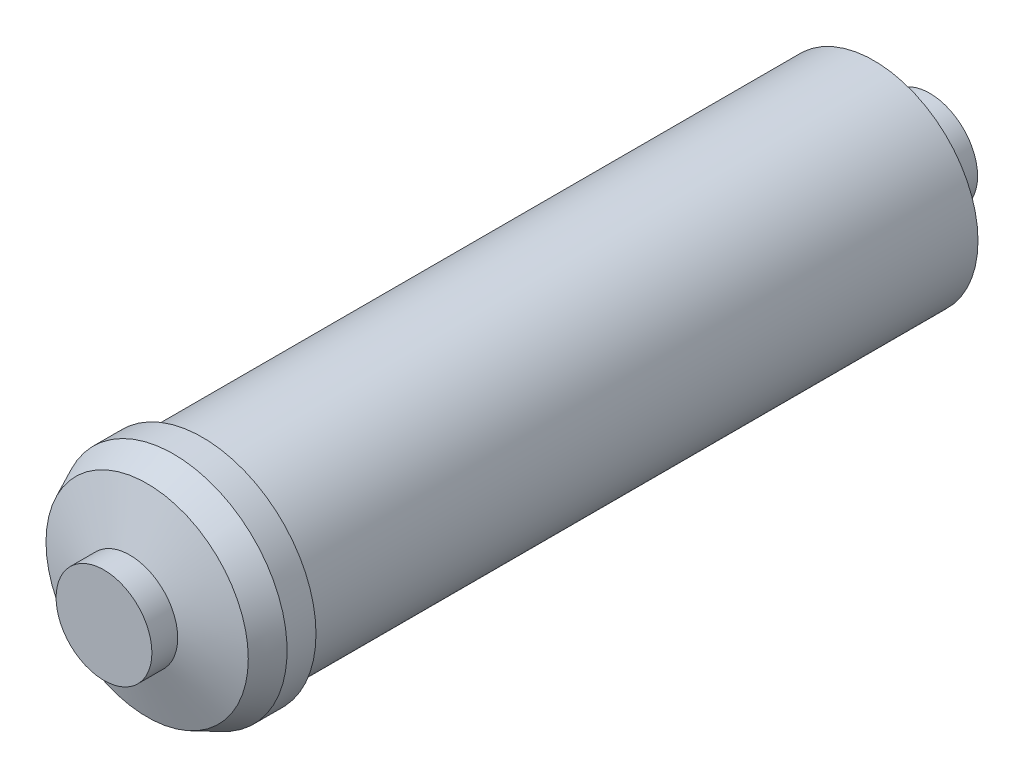
ISO-10303-21;
HEADER;
FILE_DESCRIPTION(('STEP AP214'),'2;1');
FILE_NAME('part.step','',(''),(''),'','','');
FILE_SCHEMA(('AUTOMOTIVE_DESIGN { 1 0 10303 214 1 1 1 1 }'));
ENDSEC;
DATA;
#1=APPLICATION_CONTEXT('core data for automotive mechanical design processes');
#2=APPLICATION_PROTOCOL_DEFINITION('international standard','automotive_design',2000,#1);
#3=PRODUCT_CONTEXT('',#1,'mechanical');
#4=PRODUCT('Part','Part','',(#3));
#5=PRODUCT_RELATED_PRODUCT_CATEGORY('part','',(#4));
#6=PRODUCT_DEFINITION_FORMATION('','',#4);
#7=PRODUCT_DEFINITION_CONTEXT('part definition',#1,'design');
#8=PRODUCT_DEFINITION('design','',#6,#7);
#9=PRODUCT_DEFINITION_SHAPE('','',#8);
#10=(LENGTH_UNIT() NAMED_UNIT(*) SI_UNIT(.MILLI.,.METRE.));
#11=(NAMED_UNIT(*) PLANE_ANGLE_UNIT() SI_UNIT($,.RADIAN.));
#12=(NAMED_UNIT(*) SI_UNIT($,.STERADIAN.) SOLID_ANGLE_UNIT());
#13=UNCERTAINTY_MEASURE_WITH_UNIT(LENGTH_MEASURE(1.E-05),#10,'distance_accuracy_value','');
#14=(GEOMETRIC_REPRESENTATION_CONTEXT(3) GLOBAL_UNCERTAINTY_ASSIGNED_CONTEXT((#13)) GLOBAL_UNIT_ASSIGNED_CONTEXT((#10,
#11,#12)) REPRESENTATION_CONTEXT('',''));
#15=CARTESIAN_POINT('',(0.,0.,0.));
#16=DIRECTION('',(0.,0.,1.));
#17=DIRECTION('',(1.,0.,0.));
#18=AXIS2_PLACEMENT_3D('',#15,#16,#17);
#19=CARTESIAN_POINT('',(0.,0.,8.255));
#20=DIRECTION('',(0.,0.,-1.));
#21=DIRECTION('',(-1.,0.,0.));
#22=AXIS2_PLACEMENT_3D('',#19,#20,#21);
#23=CYLINDRICAL_SURFACE('',#22,14.732);
#24=CARTESIAN_POINT('',(0.,0.,8.255));
#25=DIRECTION('',(0.,0.,1.));
#26=DIRECTION('',(1.,0.,0.));
#27=AXIS2_PLACEMENT_3D('',#24,#25,#26);
#28=CIRCLE('',#27,14.732);
#29=CARTESIAN_POINT('',(14.732,0.,8.255));
#30=VERTEX_POINT('',#29);
#31=EDGE_CURVE('E11',#30,#30,#28,.T.);
#32=ORIENTED_EDGE('',*,*,#31,.F.);
#33=EDGE_LOOP('',(#32));
#34=FACE_BOUND('',#33,.T.);
#35=CARTESIAN_POINT('',(0.,0.,0.));
#36=DIRECTION('',(0.,0.,1.));
#37=DIRECTION('',(1.,0.,0.));
#38=AXIS2_PLACEMENT_3D('',#35,#36,#37);
#39=CIRCLE('',#38,14.732);
#40=CARTESIAN_POINT('',(14.732,0.,0.));
#41=VERTEX_POINT('',#40);
#42=EDGE_CURVE('E53',#41,#41,#39,.T.);
#43=ORIENTED_EDGE('',*,*,#42,.T.);
#44=EDGE_LOOP('',(#43));
#45=FACE_BOUND('',#44,.T.);
#46=ADVANCED_FACE('F50',(#34,#45),#23,.T.);
#47=CARTESIAN_POINT('',(0.,0.,0.));
#48=DIRECTION('',(0.,0.,1.));
#49=DIRECTION('',(1.,0.,0.));
#50=AXIS2_PLACEMENT_3D('',#47,#48,#49);
#51=PLANE('',#50);
#52=ORIENTED_EDGE('',*,*,#42,.F.);
#53=EDGE_LOOP('',(#52));
#54=FACE_BOUND('',#53,.T.);
#55=ADVANCED_FACE('F87',(#54),#51,.F.);
#56=CARTESIAN_POINT('',(0.,0.,8.255));
#57=DIRECTION('',(0.,0.,1.));
#58=DIRECTION('',(1.,0.,0.));
#59=AXIS2_PLACEMENT_3D('',#56,#57,#58);
#60=CONICAL_SURFACE('',#59,14.732,1.0954533446284);
#61=ORIENTED_EDGE('',*,*,#31,.T.);
#62=EDGE_LOOP('',(#61));
#63=FACE_BOUND('',#62,.T.);
#64=CARTESIAN_POINT('',(0.,0.,17.145));
#65=DIRECTION('',(0.,0.,1.));
#66=DIRECTION('',(1.,0.,0.));
#67=AXIS2_PLACEMENT_3D('',#64,#65,#66);
#68=CIRCLE('',#67,32.004);
#69=CARTESIAN_POINT('',(32.004,0.,17.145));
#70=VERTEX_POINT('',#69);
#71=EDGE_CURVE('E56',#70,#70,#68,.T.);
#72=ORIENTED_EDGE('',*,*,#71,.F.);
#73=EDGE_LOOP('',(#72));
#74=FACE_BOUND('',#73,.T.);
#75=ADVANCED_FACE('F83',(#63,#74),#60,.T.);
#76=CARTESIAN_POINT('',(0.,0.,223.7232));
#77=DIRECTION('',(0.,0.,-1.));
#78=DIRECTION('',(-1.,0.,0.));
#79=AXIS2_PLACEMENT_3D('',#76,#77,#78);
#80=CYLINDRICAL_SURFACE('',#79,32.004);
#81=CARTESIAN_POINT('',(0.,0.,223.7232));
#82=DIRECTION('',(0.,0.,1.));
#83=DIRECTION('',(1.,0.,0.));
#84=AXIS2_PLACEMENT_3D('',#81,#82,#83);
#85=CIRCLE('',#84,32.004);
#86=CARTESIAN_POINT('',(32.004,0.,223.7232));
#87=VERTEX_POINT('',#86);
#88=EDGE_CURVE('E105',#87,#87,#85,.T.);
#89=ORIENTED_EDGE('',*,*,#88,.F.);
#90=EDGE_LOOP('',(#89));
#91=FACE_BOUND('',#90,.T.);
#92=ORIENTED_EDGE('',*,*,#71,.T.);
#93=EDGE_LOOP('',(#92));
#94=FACE_BOUND('',#93,.T.);
#95=ADVANCED_FACE('F73',(#91,#94),#80,.T.);
#96=CARTESIAN_POINT('',(0.,0.,232.6132));
#97=DIRECTION('',(0.,0.,-1.));
#98=DIRECTION('',(-1.,0.,0.));
#99=AXIS2_PLACEMENT_3D('',#96,#97,#98);
#100=CYLINDRICAL_SURFACE('',#99,34.925);
#101=CARTESIAN_POINT('',(0.,0.,232.6132));
#102=DIRECTION('',(0.,0.,-1.));
#103=DIRECTION('',(-1.,0.,0.));
#104=AXIS2_PLACEMENT_3D('',#101,#102,#103);
#105=CIRCLE('',#104,34.925);
#106=CARTESIAN_POINT('',(-34.925,0.,232.6132));
#107=VERTEX_POINT('',#106);
#108=EDGE_CURVE('E102',#107,#107,#105,.F.);
#109=ORIENTED_EDGE('',*,*,#108,.F.);
#110=EDGE_LOOP('',(#109));
#111=FACE_BOUND('',#110,.T.);
#112=CARTESIAN_POINT('',(0.,0.,223.7232));
#113=DIRECTION('',(0.,0.,1.));
#114=DIRECTION('',(1.,0.,0.));
#115=AXIS2_PLACEMENT_3D('',#112,#113,#114);
#116=CIRCLE('',#115,34.925);
#117=CARTESIAN_POINT('',(34.925,0.,223.7232));
#118=VERTEX_POINT('',#117);
#119=EDGE_CURVE('E106',#118,#118,#116,.T.);
#120=ORIENTED_EDGE('',*,*,#119,.T.);
#121=EDGE_LOOP('',(#120));
#122=FACE_BOUND('',#121,.T.);
#123=ADVANCED_FACE('F85',(#111,#122),#100,.T.);
#124=CARTESIAN_POINT('',(0.,0.,223.7232));
#125=DIRECTION('',(0.,0.,1.));
#126=DIRECTION('',(1.,0.,0.));
#127=AXIS2_PLACEMENT_3D('',#124,#125,#126);
#128=PLANE('',#127);
#129=ORIENTED_EDGE('',*,*,#88,.T.);
#130=EDGE_LOOP('',(#129));
#131=FACE_BOUND('',#130,.T.);
#132=ORIENTED_EDGE('',*,*,#119,.F.);
#133=EDGE_LOOP('',(#132));
#134=FACE_BOUND('',#133,.T.);
#135=ADVANCED_FACE('F134',(#131,#134),#128,.F.);
#136=CARTESIAN_POINT('',(0.,0.,240.7412));
#137=DIRECTION('',(0.,0.,-1.));
#138=DIRECTION('',(-1.,0.,0.));
#139=AXIS2_PLACEMENT_3D('',#136,#137,#138);
#140=CONICAL_SURFACE('',#139,31.115,0.438336559857958);
#141=ORIENTED_EDGE('',*,*,#108,.T.);
#142=EDGE_LOOP('',(#141));
#143=FACE_BOUND('',#142,.T.);
#144=CARTESIAN_POINT('',(0.,0.,240.7412));
#145=DIRECTION('',(0.,0.,1.));
#146=DIRECTION('',(1.,0.,0.));
#147=AXIS2_PLACEMENT_3D('',#144,#145,#146);
#148=CIRCLE('',#147,31.115);
#149=CARTESIAN_POINT('',(31.115,0.,240.7412));
#150=VERTEX_POINT('',#149);
#151=EDGE_CURVE('E107',#150,#150,#148,.T.);
#152=ORIENTED_EDGE('',*,*,#151,.F.);
#153=EDGE_LOOP('',(#152));
#154=FACE_BOUND('',#153,.T.);
#155=ADVANCED_FACE('F128',(#143,#154),#140,.T.);
#156=CARTESIAN_POINT('',(0.,0.,246.0752));
#157=DIRECTION('',(0.,0.,-1.));
#158=DIRECTION('',(-1.,0.,0.));
#159=AXIS2_PLACEMENT_3D('',#156,#157,#158);
#160=CONICAL_SURFACE('',#159,14.732,1.25603866540359);
#161=ORIENTED_EDGE('',*,*,#151,.T.);
#162=EDGE_LOOP('',(#161));
#163=FACE_BOUND('',#162,.T.);
#164=CARTESIAN_POINT('',(0.,0.,246.0752));
#165=DIRECTION('',(0.,0.,1.));
#166=DIRECTION('',(1.,0.,0.));
#167=AXIS2_PLACEMENT_3D('',#164,#165,#166);
#168=CIRCLE('',#167,14.732);
#169=CARTESIAN_POINT('',(14.732,0.,246.0752));
#170=VERTEX_POINT('',#169);
#171=EDGE_CURVE('E115',#170,#170,#168,.T.);
#172=ORIENTED_EDGE('',*,*,#171,.F.);
#173=EDGE_LOOP('',(#172));
#174=FACE_BOUND('',#173,.T.);
#175=ADVANCED_FACE('F121',(#163,#174),#160,.T.);
#176=CARTESIAN_POINT('',(0.,0.,254.0127));
#177=DIRECTION('',(0.,0.,-1.));
#178=DIRECTION('',(-1.,0.,0.));
#179=AXIS2_PLACEMENT_3D('',#176,#177,#178);
#180=CYLINDRICAL_SURFACE('',#179,14.732);
#181=CARTESIAN_POINT('',(0.,0.,254.0127));
#182=DIRECTION('',(0.,0.,1.));
#183=DIRECTION('',(1.,0.,0.));
#184=AXIS2_PLACEMENT_3D('',#181,#182,#183);
#185=CIRCLE('',#184,14.732);
#186=CARTESIAN_POINT('',(14.732,0.,254.0127));
#187=VERTEX_POINT('',#186);
#188=EDGE_CURVE('E114',#187,#187,#185,.T.);
#189=ORIENTED_EDGE('',*,*,#188,.F.);
#190=EDGE_LOOP('',(#189));
#191=FACE_BOUND('',#190,.T.);
#192=ORIENTED_EDGE('',*,*,#171,.T.);
#193=EDGE_LOOP('',(#192));
#194=FACE_BOUND('',#193,.T.);
#195=ADVANCED_FACE('F122',(#191,#194),#180,.T.);
#196=CARTESIAN_POINT('',(0.,0.,254.0127));
#197=DIRECTION('',(0.,0.,1.));
#198=DIRECTION('',(1.,0.,0.));
#199=AXIS2_PLACEMENT_3D('',#196,#197,#198);
#200=PLANE('',#199);
#201=ORIENTED_EDGE('',*,*,#188,.T.);
#202=EDGE_LOOP('',(#201));
#203=FACE_BOUND('',#202,.T.);
#204=ADVANCED_FACE('F118',(#203),#200,.T.);
#205=CLOSED_SHELL('',(#46,#55,#75,#95,#123,#135,#155,#175,#195,#204));
#206=MANIFOLD_SOLID_BREP('B2',#205);
#207=ADVANCED_BREP_SHAPE_REPRESENTATION('',(#18,#206),#14);
#208=SHAPE_DEFINITION_REPRESENTATION(#9,#207);
ENDSEC;
END-ISO-10303-21;
